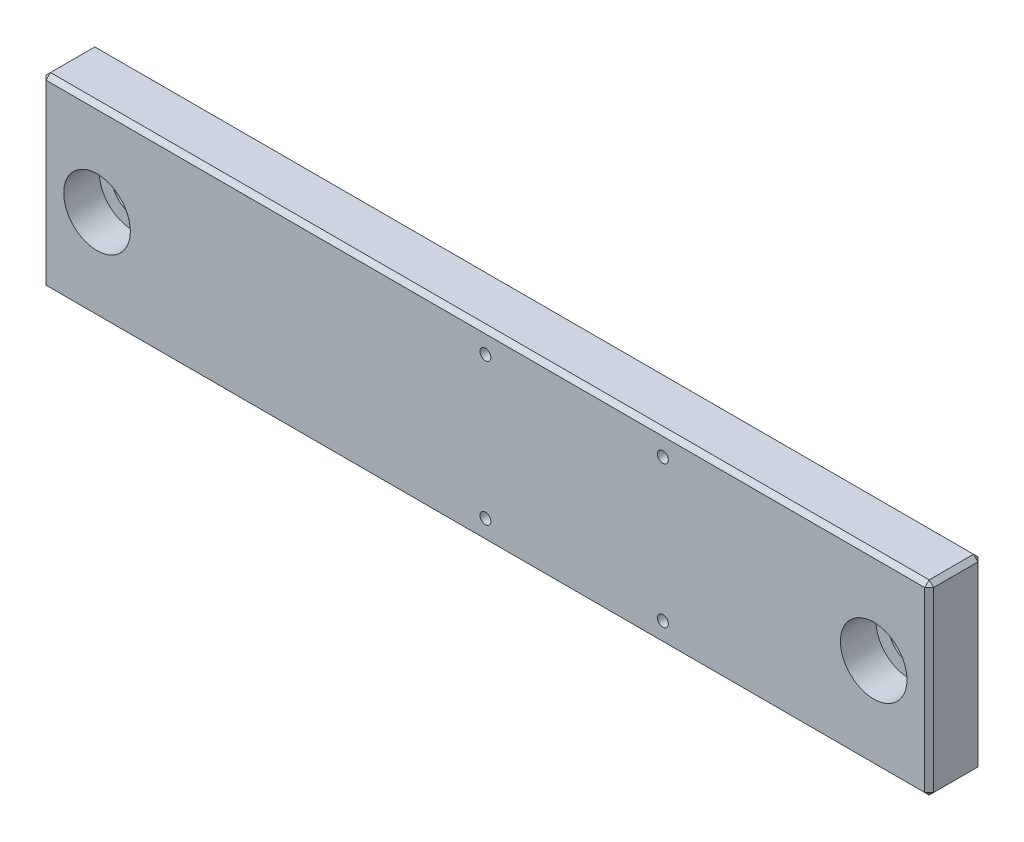
ISO-10303-21;
HEADER;
FILE_DESCRIPTION(('STEP AP214'),'2;1');
FILE_NAME('part.step','',(''),(''),'','','');
FILE_SCHEMA(('AUTOMOTIVE_DESIGN { 1 0 10303 214 1 1 1 1 }'));
ENDSEC;
DATA;
#1=APPLICATION_CONTEXT('core data for automotive mechanical design processes');
#2=APPLICATION_PROTOCOL_DEFINITION('international standard','automotive_design',2000,#1);
#3=PRODUCT_CONTEXT('',#1,'mechanical');
#4=PRODUCT('Part','Part','',(#3));
#5=PRODUCT_RELATED_PRODUCT_CATEGORY('part','',(#4));
#6=PRODUCT_DEFINITION_FORMATION('','',#4);
#7=PRODUCT_DEFINITION_CONTEXT('part definition',#1,'design');
#8=PRODUCT_DEFINITION('design','',#6,#7);
#9=PRODUCT_DEFINITION_SHAPE('','',#8);
#10=(LENGTH_UNIT() NAMED_UNIT(*) SI_UNIT(.MILLI.,.METRE.));
#11=(NAMED_UNIT(*) PLANE_ANGLE_UNIT() SI_UNIT($,.RADIAN.));
#12=(NAMED_UNIT(*) SI_UNIT($,.STERADIAN.) SOLID_ANGLE_UNIT());
#13=UNCERTAINTY_MEASURE_WITH_UNIT(LENGTH_MEASURE(1.E-05),#10,'distance_accuracy_value','');
#14=(GEOMETRIC_REPRESENTATION_CONTEXT(3) GLOBAL_UNCERTAINTY_ASSIGNED_CONTEXT((#13)) GLOBAL_UNIT_ASSIGNED_CONTEXT((#10,
#11,#12)) REPRESENTATION_CONTEXT('',''));
#15=CARTESIAN_POINT('',(0.,0.,0.));
#16=DIRECTION('',(0.,0.,1.));
#17=DIRECTION('',(1.,0.,0.));
#18=AXIS2_PLACEMENT_3D('',#15,#16,#17);
#19=CARTESIAN_POINT('',(187.5,21.,4.));
#20=DIRECTION('',(0.,0.,-1.));
#21=DIRECTION('',(-1.,0.,0.));
#22=AXIS2_PLACEMENT_3D('',#19,#20,#21);
#23=PLANE('',#22);
#24=CARTESIAN_POINT('',(187.5,21.,4.));
#25=DIRECTION('',(0.,0.,1.));
#26=DIRECTION('',(1.,0.,0.));
#27=AXIS2_PLACEMENT_3D('',#24,#25,#26);
#28=CIRCLE('',#27,7.5);
#29=CARTESIAN_POINT('',(195.,21.,4.));
#30=VERTEX_POINT('',#29);
#31=EDGE_CURVE('E11',#30,#30,#28,.T.);
#32=ORIENTED_EDGE('',*,*,#31,.T.);
#33=EDGE_LOOP('',(#32));
#34=FACE_BOUND('',#33,.T.);
#35=CARTESIAN_POINT('',(187.5,21.,3.99999999999999));
#36=DIRECTION('',(0.,0.,1.));
#37=DIRECTION('',(1.,0.,0.));
#38=AXIS2_PLACEMENT_3D('',#35,#36,#37);
#39=CIRCLE('',#38,4.5);
#40=CARTESIAN_POINT('',(192.,21.,3.99999999999999));
#41=VERTEX_POINT('',#40);
#42=EDGE_CURVE('E25',#41,#41,#39,.T.);
#43=ORIENTED_EDGE('',*,*,#42,.F.);
#44=EDGE_LOOP('',(#43));
#45=FACE_BOUND('',#44,.T.);
#46=ADVANCED_FACE('F16',(#34,#45),#23,.F.);
#47=CARTESIAN_POINT('',(187.5,21.,8.));
#48=DIRECTION('',(0.,0.,1.));
#49=DIRECTION('',(1.,0.,0.));
#50=AXIS2_PLACEMENT_3D('',#47,#48,#49);
#51=CYLINDRICAL_SURFACE('',#50,7.5);
#52=CARTESIAN_POINT('',(187.5,21.,12.));
#53=DIRECTION('',(0.,0.,-1.));
#54=DIRECTION('',(0.,-1.,0.));
#55=AXIS2_PLACEMENT_3D('',#52,#53,#54);
#56=CIRCLE('',#55,7.5);
#57=CARTESIAN_POINT('',(187.5,13.5,12.));
#58=VERTEX_POINT('',#57);
#59=EDGE_CURVE('E331',#58,#58,#56,.T.);
#60=ORIENTED_EDGE('',*,*,#59,.F.);
#61=EDGE_LOOP('',(#60));
#62=FACE_BOUND('',#61,.T.);
#63=ORIENTED_EDGE('',*,*,#31,.F.);
#64=EDGE_LOOP('',(#63));
#65=FACE_BOUND('',#64,.T.);
#66=ADVANCED_FACE('F313',(#62,#65),#51,.F.);
#67=CARTESIAN_POINT('',(187.5,21.,-192.714435250668));
#68=DIRECTION('',(0.,0.,1.));
#69=DIRECTION('',(1.,0.,0.));
#70=AXIS2_PLACEMENT_3D('',#67,#68,#69);
#71=CYLINDRICAL_SURFACE('',#70,4.5);
#72=CARTESIAN_POINT('',(187.5,21.,0.));
#73=DIRECTION('',(0.,0.,1.));
#74=DIRECTION('',(1.,0.,0.));
#75=AXIS2_PLACEMENT_3D('',#72,#73,#74);
#76=CIRCLE('',#75,4.5);
#77=CARTESIAN_POINT('',(192.,21.,0.));
#78=VERTEX_POINT('',#77);
#79=EDGE_CURVE('E174',#78,#78,#76,.T.);
#80=ORIENTED_EDGE('',*,*,#79,.F.);
#81=EDGE_LOOP('',(#80));
#82=FACE_BOUND('',#81,.T.);
#83=ORIENTED_EDGE('',*,*,#42,.T.);
#84=EDGE_LOOP('',(#83));
#85=FACE_BOUND('',#84,.T.);
#86=ADVANCED_FACE('F318',(#82,#85),#71,.F.);
#87=CARTESIAN_POINT('',(12.5,21.,4.));
#88=DIRECTION('',(0.,0.,-1.));
#89=DIRECTION('',(-1.,0.,0.));
#90=AXIS2_PLACEMENT_3D('',#87,#88,#89);
#91=PLANE('',#90);
#92=CARTESIAN_POINT('',(12.5,21.,4.));
#93=DIRECTION('',(0.,0.,1.));
#94=DIRECTION('',(1.,0.,0.));
#95=AXIS2_PLACEMENT_3D('',#92,#93,#94);
#96=CIRCLE('',#95,7.5);
#97=CARTESIAN_POINT('',(20.,21.,4.));
#98=VERTEX_POINT('',#97);
#99=EDGE_CURVE('E326',#98,#98,#96,.T.);
#100=ORIENTED_EDGE('',*,*,#99,.T.);
#101=EDGE_LOOP('',(#100));
#102=FACE_BOUND('',#101,.T.);
#103=CARTESIAN_POINT('',(12.5,21.,3.99999999999999));
#104=DIRECTION('',(0.,0.,1.));
#105=DIRECTION('',(1.,0.,0.));
#106=AXIS2_PLACEMENT_3D('',#103,#104,#105);
#107=CIRCLE('',#106,4.5);
#108=CARTESIAN_POINT('',(17.,21.,3.99999999999999));
#109=VERTEX_POINT('',#108);
#110=EDGE_CURVE('E186',#109,#109,#107,.T.);
#111=ORIENTED_EDGE('',*,*,#110,.F.);
#112=EDGE_LOOP('',(#111));
#113=FACE_BOUND('',#112,.T.);
#114=ADVANCED_FACE('F481',(#102,#113),#91,.F.);
#115=CARTESIAN_POINT('',(12.5,21.,8.));
#116=DIRECTION('',(0.,0.,1.));
#117=DIRECTION('',(1.,0.,0.));
#118=AXIS2_PLACEMENT_3D('',#115,#116,#117);
#119=CYLINDRICAL_SURFACE('',#118,7.5);
#120=CARTESIAN_POINT('',(12.5,21.,12.));
#121=DIRECTION('',(0.,0.,-1.));
#122=DIRECTION('',(0.,-1.,0.));
#123=AXIS2_PLACEMENT_3D('',#120,#121,#122);
#124=CIRCLE('',#123,7.5);
#125=CARTESIAN_POINT('',(12.5,13.5,12.));
#126=VERTEX_POINT('',#125);
#127=EDGE_CURVE('E335',#126,#126,#124,.T.);
#128=ORIENTED_EDGE('',*,*,#127,.F.);
#129=EDGE_LOOP('',(#128));
#130=FACE_BOUND('',#129,.T.);
#131=ORIENTED_EDGE('',*,*,#99,.F.);
#132=EDGE_LOOP('',(#131));
#133=FACE_BOUND('',#132,.T.);
#134=ADVANCED_FACE('F483',(#130,#133),#119,.F.);
#135=CARTESIAN_POINT('',(12.5,21.,-192.714435250668));
#136=DIRECTION('',(0.,0.,1.));
#137=DIRECTION('',(1.,0.,0.));
#138=AXIS2_PLACEMENT_3D('',#135,#136,#137);
#139=CYLINDRICAL_SURFACE('',#138,4.5);
#140=CARTESIAN_POINT('',(12.5,21.,0.));
#141=DIRECTION('',(0.,0.,1.));
#142=DIRECTION('',(1.,0.,0.));
#143=AXIS2_PLACEMENT_3D('',#140,#141,#142);
#144=CIRCLE('',#143,4.5);
#145=CARTESIAN_POINT('',(17.,21.,0.));
#146=VERTEX_POINT('',#145);
#147=EDGE_CURVE('E337',#146,#146,#144,.T.);
#148=ORIENTED_EDGE('',*,*,#147,.F.);
#149=EDGE_LOOP('',(#148));
#150=FACE_BOUND('',#149,.T.);
#151=ORIENTED_EDGE('',*,*,#110,.T.);
#152=EDGE_LOOP('',(#151));
#153=FACE_BOUND('',#152,.T.);
#154=ADVANCED_FACE('F489',(#150,#153),#139,.F.);
#155=CARTESIAN_POINT('',(100.,37.,-192.714435250668));
#156=DIRECTION('',(0.,0.,1.));
#157=DIRECTION('',(1.,0.,0.));
#158=AXIS2_PLACEMENT_3D('',#155,#156,#157);
#159=CYLINDRICAL_SURFACE('',#158,1.2295);
#160=CARTESIAN_POINT('',(100.,37.,0.));
#161=DIRECTION('',(0.,0.,1.));
#162=DIRECTION('',(1.,0.,0.));
#163=AXIS2_PLACEMENT_3D('',#160,#161,#162);
#164=CIRCLE('',#163,1.2295);
#165=CARTESIAN_POINT('',(101.2295,37.,0.));
#166=VERTEX_POINT('',#165);
#167=EDGE_CURVE('E346',#166,#166,#164,.T.);
#168=ORIENTED_EDGE('',*,*,#167,.F.);
#169=EDGE_LOOP('',(#168));
#170=FACE_BOUND('',#169,.T.);
#171=CARTESIAN_POINT('',(100.,37.,12.));
#172=DIRECTION('',(0.,0.,-1.));
#173=DIRECTION('',(0.,-1.,0.));
#174=AXIS2_PLACEMENT_3D('',#171,#172,#173);
#175=CIRCLE('',#174,1.2295);
#176=CARTESIAN_POINT('',(100.,35.7705,12.));
#177=VERTEX_POINT('',#176);
#178=EDGE_CURVE('E343',#177,#177,#175,.T.);
#179=ORIENTED_EDGE('',*,*,#178,.F.);
#180=EDGE_LOOP('',(#179));
#181=FACE_BOUND('',#180,.T.);
#182=ADVANCED_FACE('F499',(#170,#181),#159,.F.);
#183=CARTESIAN_POINT('',(100.,5.,-192.714435250668));
#184=DIRECTION('',(0.,0.,1.));
#185=DIRECTION('',(1.,0.,0.));
#186=AXIS2_PLACEMENT_3D('',#183,#184,#185);
#187=CYLINDRICAL_SURFACE('',#186,1.2295);
#188=CARTESIAN_POINT('',(100.,5.,0.));
#189=DIRECTION('',(0.,0.,1.));
#190=DIRECTION('',(1.,0.,0.));
#191=AXIS2_PLACEMENT_3D('',#188,#189,#190);
#192=CIRCLE('',#191,1.2295);
#193=CARTESIAN_POINT('',(101.2295,5.,0.));
#194=VERTEX_POINT('',#193);
#195=EDGE_CURVE('E349',#194,#194,#192,.T.);
#196=ORIENTED_EDGE('',*,*,#195,.F.);
#197=EDGE_LOOP('',(#196));
#198=FACE_BOUND('',#197,.T.);
#199=CARTESIAN_POINT('',(100.,5.,12.));
#200=DIRECTION('',(0.,0.,-1.));
#201=DIRECTION('',(0.,-1.,0.));
#202=AXIS2_PLACEMENT_3D('',#199,#200,#201);
#203=CIRCLE('',#202,1.2295);
#204=CARTESIAN_POINT('',(100.,3.7705,12.));
#205=VERTEX_POINT('',#204);
#206=EDGE_CURVE('E352',#205,#205,#203,.T.);
#207=ORIENTED_EDGE('',*,*,#206,.F.);
#208=EDGE_LOOP('',(#207));
#209=FACE_BOUND('',#208,.T.);
#210=ADVANCED_FACE('F505',(#198,#209),#187,.F.);
#211=CARTESIAN_POINT('',(140.,5.,-192.714435250668));
#212=DIRECTION('',(0.,0.,1.));
#213=DIRECTION('',(1.,0.,0.));
#214=AXIS2_PLACEMENT_3D('',#211,#212,#213);
#215=CYLINDRICAL_SURFACE('',#214,1.2295);
#216=CARTESIAN_POINT('',(140.,5.,0.));
#217=DIRECTION('',(0.,0.,1.));
#218=DIRECTION('',(1.,0.,0.));
#219=AXIS2_PLACEMENT_3D('',#216,#217,#218);
#220=CIRCLE('',#219,1.2295);
#221=CARTESIAN_POINT('',(141.2295,5.,0.));
#222=VERTEX_POINT('',#221);
#223=EDGE_CURVE('E355',#222,#222,#220,.T.);
#224=ORIENTED_EDGE('',*,*,#223,.F.);
#225=EDGE_LOOP('',(#224));
#226=FACE_BOUND('',#225,.T.);
#227=CARTESIAN_POINT('',(140.,5.,12.));
#228=DIRECTION('',(0.,0.,-1.));
#229=DIRECTION('',(0.,-1.,0.));
#230=AXIS2_PLACEMENT_3D('',#227,#228,#229);
#231=CIRCLE('',#230,1.2295);
#232=CARTESIAN_POINT('',(140.,3.7705,12.));
#233=VERTEX_POINT('',#232);
#234=EDGE_CURVE('E358',#233,#233,#231,.T.);
#235=ORIENTED_EDGE('',*,*,#234,.F.);
#236=EDGE_LOOP('',(#235));
#237=FACE_BOUND('',#236,.T.);
#238=ADVANCED_FACE('F512',(#226,#237),#215,.F.);
#239=CARTESIAN_POINT('',(140.,37.,-192.714435250668));
#240=DIRECTION('',(0.,0.,1.));
#241=DIRECTION('',(1.,0.,0.));
#242=AXIS2_PLACEMENT_3D('',#239,#240,#241);
#243=CYLINDRICAL_SURFACE('',#242,1.2295);
#244=CARTESIAN_POINT('',(140.,37.,0.));
#245=DIRECTION('',(0.,0.,1.));
#246=DIRECTION('',(1.,0.,0.));
#247=AXIS2_PLACEMENT_3D('',#244,#245,#246);
#248=CIRCLE('',#247,1.2295);
#249=CARTESIAN_POINT('',(141.2295,37.,0.));
#250=VERTEX_POINT('',#249);
#251=EDGE_CURVE('E334',#250,#250,#248,.T.);
#252=ORIENTED_EDGE('',*,*,#251,.F.);
#253=EDGE_LOOP('',(#252));
#254=FACE_BOUND('',#253,.T.);
#255=CARTESIAN_POINT('',(140.,37.,12.));
#256=DIRECTION('',(0.,0.,-1.));
#257=DIRECTION('',(0.,-1.,0.));
#258=AXIS2_PLACEMENT_3D('',#255,#256,#257);
#259=CIRCLE('',#258,1.2295);
#260=CARTESIAN_POINT('',(140.,35.7705,12.));
#261=VERTEX_POINT('',#260);
#262=EDGE_CURVE('E363',#261,#261,#259,.T.);
#263=ORIENTED_EDGE('',*,*,#262,.F.);
#264=EDGE_LOOP('',(#263));
#265=FACE_BOUND('',#264,.T.);
#266=ADVANCED_FACE('F516',(#254,#265),#243,.F.);
#267=CARTESIAN_POINT('',(199.,41.,0.));
#268=DIRECTION('',(0.57735026918962,0.57735026918963,-0.577350269189628));
#269=DIRECTION('',(0.,0.707106781186546,0.707106781186549));
#270=AXIS2_PLACEMENT_3D('',#267,#268,#269);
#271=PLANE('',#270);
#272=DIRECTION('',(-0.707106781186554,0.707106781186541,0.));
#273=VECTOR('',#272,1.);
#274=CARTESIAN_POINT('',(200.,41.,1.));
#275=LINE('',#274,#273);
#276=CARTESIAN_POINT('',(200.,41.,1.));
#277=VERTEX_POINT('',#276);
#278=CARTESIAN_POINT('',(199.,42.,1.));
#279=VERTEX_POINT('',#278);
#280=EDGE_CURVE('E207',#277,#279,#275,.T.);
#281=ORIENTED_EDGE('',*,*,#280,.F.);
#282=DIRECTION('',(0.707106781186553,0.,0.707106781186543));
#283=VECTOR('',#282,1.);
#284=CARTESIAN_POINT('',(199.,41.,0.));
#285=LINE('',#284,#283);
#286=CARTESIAN_POINT('',(199.,41.,0.));
#287=VERTEX_POINT('',#286);
#288=EDGE_CURVE('E34',#287,#277,#285,.T.);
#289=ORIENTED_EDGE('',*,*,#288,.F.);
#290=DIRECTION('',(0.,-0.707106781186546,-0.707106781186549));
#291=VECTOR('',#290,1.);
#292=CARTESIAN_POINT('',(199.,42.,1.));
#293=LINE('',#292,#291);
#294=EDGE_CURVE('E191',#279,#287,#293,.T.);
#295=ORIENTED_EDGE('',*,*,#294,.F.);
#296=EDGE_LOOP('',(#281,#289,#295));
#297=FACE_BOUND('',#296,.T.);
#298=ADVANCED_FACE('F371',(#297),#271,.T.);
#299=CARTESIAN_POINT('',(199.,1.,0.));
#300=DIRECTION('',(0.577350269189619,-0.577350269189629,-0.57735026918963));
#301=DIRECTION('',(0.,0.707106781186548,-0.707106781186547));
#302=AXIS2_PLACEMENT_3D('',#299,#300,#301);
#303=PLANE('',#302);
#304=DIRECTION('',(0.707106781186554,0.707106781186541,0.));
#305=VECTOR('',#304,1.);
#306=CARTESIAN_POINT('',(199.,0.,1.));
#307=LINE('',#306,#305);
#308=CARTESIAN_POINT('',(199.,0.,1.));
#309=VERTEX_POINT('',#308);
#310=CARTESIAN_POINT('',(200.,0.999999999999997,1.));
#311=VERTEX_POINT('',#310);
#312=EDGE_CURVE('E227',#309,#311,#307,.T.);
#313=ORIENTED_EDGE('',*,*,#312,.F.);
#314=DIRECTION('',(0.,-0.707106781186548,0.707106781186547));
#315=VECTOR('',#314,1.);
#316=CARTESIAN_POINT('',(199.,1.,0.));
#317=LINE('',#316,#315);
#318=CARTESIAN_POINT('',(199.,1.,0.));
#319=VERTEX_POINT('',#318);
#320=EDGE_CURVE('E177',#319,#309,#317,.T.);
#321=ORIENTED_EDGE('',*,*,#320,.F.);
#322=DIRECTION('',(-0.707106781186553,0.,-0.707106781186543));
#323=VECTOR('',#322,1.);
#324=CARTESIAN_POINT('',(200.,0.999999999999997,1.));
#325=LINE('',#324,#323);
#326=EDGE_CURVE('E169',#311,#319,#325,.T.);
#327=ORIENTED_EDGE('',*,*,#326,.F.);
#328=EDGE_LOOP('',(#313,#321,#327));
#329=FACE_BOUND('',#328,.T.);
#330=ADVANCED_FACE('F523',(#329),#303,.T.);
#331=CARTESIAN_POINT('',(0.999999999999997,41.,0.));
#332=DIRECTION('',(-0.577350269189626,0.577350269189627,-0.577350269189625));
#333=DIRECTION('',(-0.707106781186548,-0.707106781186547,0.));
#334=AXIS2_PLACEMENT_3D('',#331,#332,#333);
#335=PLANE('',#334);
#336=DIRECTION('',(-0.707106781186549,-0.707106781186546,0.));
#337=VECTOR('',#336,1.);
#338=CARTESIAN_POINT('',(0.999999999999997,42.,1.));
#339=LINE('',#338,#337);
#340=CARTESIAN_POINT('',(0.999999999999997,42.,1.));
#341=VERTEX_POINT('',#340);
#342=CARTESIAN_POINT('',(0.,41.,1.));
#343=VERTEX_POINT('',#342);
#344=EDGE_CURVE('E179',#341,#343,#339,.T.);
#345=ORIENTED_EDGE('',*,*,#344,.F.);
#346=DIRECTION('',(0.,0.707106781186546,0.707106781186549));
#347=VECTOR('',#346,1.);
#348=CARTESIAN_POINT('',(0.999999999999997,41.,0.));
#349=LINE('',#348,#347);
#350=CARTESIAN_POINT('',(0.999999999999994,41.,0.));
#351=VERTEX_POINT('',#350);
#352=EDGE_CURVE('E183',#351,#341,#349,.T.);
#353=ORIENTED_EDGE('',*,*,#352,.F.);
#354=DIRECTION('',(0.707106781186547,0.,-0.707106781186549));
#355=VECTOR('',#354,1.);
#356=CARTESIAN_POINT('',(0.,41.,1.));
#357=LINE('',#356,#355);
#358=EDGE_CURVE('E165',#343,#351,#357,.T.);
#359=ORIENTED_EDGE('',*,*,#358,.F.);
#360=EDGE_LOOP('',(#345,#353,#359));
#361=FACE_BOUND('',#360,.T.);
#362=ADVANCED_FACE('F299',(#361),#335,.T.);
#363=CARTESIAN_POINT('',(50.,41.5,0.5));
#364=DIRECTION('',(0.,0.707106781186549,-0.707106781186546));
#365=DIRECTION('',(0.,0.707106781186546,0.707106781186549));
#366=AXIS2_PLACEMENT_3D('',#363,#364,#365);
#367=PLANE('',#366);
#368=ORIENTED_EDGE('',*,*,#352,.T.);
#369=DIRECTION('',(1.,0.,0.));
#370=VECTOR('',#369,1.);
#371=CARTESIAN_POINT('',(50.,42.,1.));
#372=LINE('',#371,#370);
#373=EDGE_CURVE('E187',#341,#279,#372,.T.);
#374=ORIENTED_EDGE('',*,*,#373,.T.);
#375=ORIENTED_EDGE('',*,*,#294,.T.);
#376=DIRECTION('',(-1.,0.,0.));
#377=VECTOR('',#376,1.);
#378=CARTESIAN_POINT('',(50.,41.,0.));
#379=LINE('',#378,#377);
#380=EDGE_CURVE('E192',#287,#351,#379,.T.);
#381=ORIENTED_EDGE('',*,*,#380,.T.);
#382=EDGE_LOOP('',(#368,#374,#375,#381));
#383=FACE_BOUND('',#382,.T.);
#384=ADVANCED_FACE('F296',(#383),#367,.T.);
#385=CARTESIAN_POINT('',(199.,42.,11.));
#386=DIRECTION('',(0.57735026918962,0.57735026918963,0.577350269189628));
#387=DIRECTION('',(0.,-0.707106781186546,0.707106781186549));
#388=AXIS2_PLACEMENT_3D('',#385,#386,#387);
#389=PLANE('',#388);
#390=DIRECTION('',(-0.707106781186552,0.,0.707106781186543));
#391=VECTOR('',#390,1.);
#392=CARTESIAN_POINT('',(200.,41.,11.));
#393=LINE('',#392,#391);
#394=CARTESIAN_POINT('',(200.,41.,11.));
#395=VERTEX_POINT('',#394);
#396=CARTESIAN_POINT('',(199.,41.,12.));
#397=VERTEX_POINT('',#396);
#398=EDGE_CURVE('E196',#395,#397,#393,.T.);
#399=ORIENTED_EDGE('',*,*,#398,.F.);
#400=DIRECTION('',(0.707106781186554,-0.707106781186541,0.));
#401=VECTOR('',#400,1.);
#402=CARTESIAN_POINT('',(199.,42.,11.));
#403=LINE('',#402,#401);
#404=CARTESIAN_POINT('',(199.,42.,11.));
#405=VERTEX_POINT('',#404);
#406=EDGE_CURVE('E195',#405,#395,#403,.T.);
#407=ORIENTED_EDGE('',*,*,#406,.F.);
#408=DIRECTION('',(0.,0.707106781186546,-0.707106781186549));
#409=VECTOR('',#408,1.);
#410=CARTESIAN_POINT('',(199.,41.,12.));
#411=LINE('',#410,#409);
#412=EDGE_CURVE('E153',#397,#405,#411,.T.);
#413=ORIENTED_EDGE('',*,*,#412,.F.);
#414=EDGE_LOOP('',(#399,#407,#413));
#415=FACE_BOUND('',#414,.T.);
#416=ADVANCED_FACE('F376',(#415),#389,.T.);
#417=CARTESIAN_POINT('',(199.5,41.5,0.));
#418=DIRECTION('',(0.707106781186541,0.707106781186554,0.));
#419=DIRECTION('',(-0.707106781186554,0.707106781186541,0.));
#420=AXIS2_PLACEMENT_3D('',#417,#418,#419);
#421=PLANE('',#420);
#422=ORIENTED_EDGE('',*,*,#406,.T.);
#423=DIRECTION('',(0.,0.,-1.));
#424=VECTOR('',#423,1.);
#425=CARTESIAN_POINT('',(200.,41.,0.));
#426=LINE('',#425,#424);
#427=EDGE_CURVE('E203',#395,#277,#426,.T.);
#428=ORIENTED_EDGE('',*,*,#427,.T.);
#429=ORIENTED_EDGE('',*,*,#280,.T.);
#430=DIRECTION('',(0.,0.,1.));
#431=VECTOR('',#430,1.);
#432=CARTESIAN_POINT('',(199.,42.,0.));
#433=LINE('',#432,#431);
#434=EDGE_CURVE('E208',#279,#405,#433,.T.);
#435=ORIENTED_EDGE('',*,*,#434,.T.);
#436=EDGE_LOOP('',(#422,#428,#429,#435));
#437=FACE_BOUND('',#436,.T.);
#438=ADVANCED_FACE('F373',(#437),#421,.T.);
#439=CARTESIAN_POINT('',(1.00000000000001,0.,1.));
#440=DIRECTION('',(-0.577350269189624,-0.577350269189632,-0.577350269189622));
#441=DIRECTION('',(0.707106781186552,-0.707106781186542,0.));
#442=AXIS2_PLACEMENT_3D('',#439,#440,#441);
#443=PLANE('',#442);
#444=DIRECTION('',(-0.707106781186547,0.,0.707106781186549));
#445=VECTOR('',#444,1.);
#446=CARTESIAN_POINT('',(0.999999999999997,1.,0.));
#447=LINE('',#446,#445);
#448=CARTESIAN_POINT('',(0.999999999999997,1.,0.));
#449=VERTEX_POINT('',#448);
#450=CARTESIAN_POINT('',(0.,1.,1.));
#451=VERTEX_POINT('',#450);
#452=EDGE_CURVE('E161',#449,#451,#447,.T.);
#453=ORIENTED_EDGE('',*,*,#452,.F.);
#454=DIRECTION('',(0.,0.707106781186548,-0.707106781186547));
#455=VECTOR('',#454,1.);
#456=CARTESIAN_POINT('',(1.00000000000001,0.,1.));
#457=LINE('',#456,#455);
#458=CARTESIAN_POINT('',(1.00000000000001,0.,1.));
#459=VERTEX_POINT('',#458);
#460=EDGE_CURVE('E212',#459,#449,#457,.T.);
#461=ORIENTED_EDGE('',*,*,#460,.F.);
#462=DIRECTION('',(0.707106781186553,-0.707106781186542,0.));
#463=VECTOR('',#462,1.);
#464=CARTESIAN_POINT('',(0.,1.,1.));
#465=LINE('',#464,#463);
#466=EDGE_CURVE('E127',#451,#459,#465,.T.);
#467=ORIENTED_EDGE('',*,*,#466,.F.);
#468=EDGE_LOOP('',(#453,#461,#467));
#469=FACE_BOUND('',#468,.T.);
#470=ADVANCED_FACE('F253',(#469),#443,.T.);
#471=CARTESIAN_POINT('',(150.,0.5,0.5));
#472=DIRECTION('',(0.,-0.707106781186547,-0.707106781186548));
#473=DIRECTION('',(0.,0.707106781186548,-0.707106781186547));
#474=AXIS2_PLACEMENT_3D('',#471,#472,#473);
#475=PLANE('',#474);
#476=ORIENTED_EDGE('',*,*,#320,.T.);
#477=DIRECTION('',(-1.,0.,0.));
#478=VECTOR('',#477,1.);
#479=CARTESIAN_POINT('',(150.,0.,1.));
#480=LINE('',#479,#478);
#481=EDGE_CURVE('E215',#309,#459,#480,.T.);
#482=ORIENTED_EDGE('',*,*,#481,.T.);
#483=ORIENTED_EDGE('',*,*,#460,.T.);
#484=DIRECTION('',(1.,0.,0.));
#485=VECTOR('',#484,1.);
#486=CARTESIAN_POINT('',(150.,1.,0.));
#487=LINE('',#486,#485);
#488=EDGE_CURVE('E216',#449,#319,#487,.T.);
#489=ORIENTED_EDGE('',*,*,#488,.T.);
#490=EDGE_LOOP('',(#476,#482,#483,#489));
#491=FACE_BOUND('',#490,.T.);
#492=ADVANCED_FACE('F256',(#491),#475,.T.);
#493=CARTESIAN_POINT('',(200.,0.999999999999997,11.));
#494=DIRECTION('',(0.577350269189619,-0.577350269189629,0.577350269189629));
#495=DIRECTION('',(0.,-0.707106781186548,-0.707106781186548));
#496=AXIS2_PLACEMENT_3D('',#493,#494,#495);
#497=PLANE('',#496);
#498=DIRECTION('',(0.,0.707106781186548,0.707106781186548));
#499=VECTOR('',#498,1.);
#500=CARTESIAN_POINT('',(199.,0.,11.));
#501=LINE('',#500,#499);
#502=CARTESIAN_POINT('',(199.,0.,11.));
#503=VERTEX_POINT('',#502);
#504=CARTESIAN_POINT('',(199.,1.,12.));
#505=VERTEX_POINT('',#504);
#506=EDGE_CURVE('E142',#503,#505,#501,.T.);
#507=ORIENTED_EDGE('',*,*,#506,.F.);
#508=DIRECTION('',(-0.707106781186554,-0.707106781186541,0.));
#509=VECTOR('',#508,1.);
#510=CARTESIAN_POINT('',(200.,0.999999999999997,11.));
#511=LINE('',#510,#509);
#512=CARTESIAN_POINT('',(200.,0.999999999999997,11.));
#513=VERTEX_POINT('',#512);
#514=EDGE_CURVE('E220',#513,#503,#511,.T.);
#515=ORIENTED_EDGE('',*,*,#514,.F.);
#516=DIRECTION('',(0.707106781186552,0.,-0.707106781186543));
#517=VECTOR('',#516,1.);
#518=CARTESIAN_POINT('',(199.,1.,12.));
#519=LINE('',#518,#517);
#520=EDGE_CURVE('E223',#505,#513,#519,.T.);
#521=ORIENTED_EDGE('',*,*,#520,.F.);
#522=EDGE_LOOP('',(#507,#515,#521));
#523=FACE_BOUND('',#522,.T.);
#524=ADVANCED_FACE('F268',(#523),#497,.T.);
#525=CARTESIAN_POINT('',(199.5,0.499999999999998,0.));
#526=DIRECTION('',(0.707106781186541,-0.707106781186554,0.));
#527=DIRECTION('',(0.707106781186554,0.707106781186541,0.));
#528=AXIS2_PLACEMENT_3D('',#525,#526,#527);
#529=PLANE('',#528);
#530=ORIENTED_EDGE('',*,*,#514,.T.);
#531=DIRECTION('',(0.,0.,-1.));
#532=VECTOR('',#531,1.);
#533=CARTESIAN_POINT('',(199.,0.,0.));
#534=LINE('',#533,#532);
#535=EDGE_CURVE('E140',#503,#309,#534,.T.);
#536=ORIENTED_EDGE('',*,*,#535,.T.);
#537=ORIENTED_EDGE('',*,*,#312,.T.);
#538=DIRECTION('',(0.,0.,1.));
#539=VECTOR('',#538,1.);
#540=CARTESIAN_POINT('',(200.,0.999999999999997,0.));
#541=LINE('',#540,#539);
#542=EDGE_CURVE('E225',#311,#513,#541,.T.);
#543=ORIENTED_EDGE('',*,*,#542,.T.);
#544=EDGE_LOOP('',(#530,#536,#537,#543));
#545=FACE_BOUND('',#544,.T.);
#546=ADVANCED_FACE('F262',(#545),#529,.T.);
#547=CARTESIAN_POINT('',(199.5,31.5,11.5));
#548=DIRECTION('',(0.707106781186543,0.,0.707106781186552));
#549=DIRECTION('',(0.707106781186552,0.,-0.707106781186543));
#550=AXIS2_PLACEMENT_3D('',#547,#548,#549);
#551=PLANE('',#550);
#552=ORIENTED_EDGE('',*,*,#520,.T.);
#553=DIRECTION('',(0.,1.,0.));
#554=VECTOR('',#553,1.);
#555=CARTESIAN_POINT('',(200.,31.5,11.));
#556=LINE('',#555,#554);
#557=EDGE_CURVE('E199',#513,#395,#556,.T.);
#558=ORIENTED_EDGE('',*,*,#557,.T.);
#559=ORIENTED_EDGE('',*,*,#398,.T.);
#560=DIRECTION('',(0.,-1.,0.));
#561=VECTOR('',#560,1.);
#562=CARTESIAN_POINT('',(199.,31.5,12.));
#563=LINE('',#562,#561);
#564=EDGE_CURVE('E200',#397,#505,#563,.T.);
#565=ORIENTED_EDGE('',*,*,#564,.T.);
#566=EDGE_LOOP('',(#552,#558,#559,#565));
#567=FACE_BOUND('',#566,.T.);
#568=ADVANCED_FACE('F273',(#567),#551,.T.);
#569=CARTESIAN_POINT('',(0.,41.,11.));
#570=DIRECTION('',(-0.577350269189626,0.577350269189628,0.577350269189624));
#571=DIRECTION('',(-0.707106781186549,-0.707106781186546,0.));
#572=AXIS2_PLACEMENT_3D('',#569,#570,#571);
#573=PLANE('',#572);
#574=DIRECTION('',(0.,-0.707106781186546,0.707106781186549));
#575=VECTOR('',#574,1.);
#576=CARTESIAN_POINT('',(0.999999999999997,42.,11.));
#577=LINE('',#576,#575);
#578=CARTESIAN_POINT('',(0.999999999999997,42.,11.));
#579=VERTEX_POINT('',#578);
#580=CARTESIAN_POINT('',(0.999999999999997,41.,12.));
#581=VERTEX_POINT('',#580);
#582=EDGE_CURVE('E157',#579,#581,#577,.T.);
#583=ORIENTED_EDGE('',*,*,#582,.F.);
#584=DIRECTION('',(0.707106781186549,0.707106781186546,0.));
#585=VECTOR('',#584,1.);
#586=CARTESIAN_POINT('',(0.,41.,11.));
#587=LINE('',#586,#585);
#588=CARTESIAN_POINT('',(0.,41.,11.));
#589=VERTEX_POINT('',#588);
#590=EDGE_CURVE('E234',#589,#579,#587,.T.);
#591=ORIENTED_EDGE('',*,*,#590,.F.);
#592=DIRECTION('',(-0.707106781186546,0.,-0.707106781186549));
#593=VECTOR('',#592,1.);
#594=CARTESIAN_POINT('',(0.999999999999994,41.,12.));
#595=LINE('',#594,#593);
#596=EDGE_CURVE('E148',#581,#589,#595,.T.);
#597=ORIENTED_EDGE('',*,*,#596,.F.);
#598=EDGE_LOOP('',(#583,#591,#597));
#599=FACE_BOUND('',#598,.T.);
#600=ADVANCED_FACE('F282',(#599),#573,.T.);
#601=CARTESIAN_POINT('',(0.499999999999997,41.5,0.));
#602=DIRECTION('',(-0.707106781186546,0.707106781186549,0.));
#603=DIRECTION('',(-0.707106781186549,-0.707106781186546,0.));
#604=AXIS2_PLACEMENT_3D('',#601,#602,#603);
#605=PLANE('',#604);
#606=ORIENTED_EDGE('',*,*,#590,.T.);
#607=DIRECTION('',(0.,0.,-1.));
#608=VECTOR('',#607,1.);
#609=CARTESIAN_POINT('',(0.999999999999997,42.,0.));
#610=LINE('',#609,#608);
#611=EDGE_CURVE('E182',#579,#341,#610,.T.);
#612=ORIENTED_EDGE('',*,*,#611,.T.);
#613=ORIENTED_EDGE('',*,*,#344,.T.);
#614=DIRECTION('',(0.,0.,1.));
#615=VECTOR('',#614,1.);
#616=CARTESIAN_POINT('',(0.,41.,0.));
#617=LINE('',#616,#615);
#618=EDGE_CURVE('E134',#343,#589,#617,.T.);
#619=ORIENTED_EDGE('',*,*,#618,.T.);
#620=EDGE_LOOP('',(#606,#612,#613,#619));
#621=FACE_BOUND('',#620,.T.);
#622=ADVANCED_FACE('F285',(#621),#605,.T.);
#623=CARTESIAN_POINT('',(1.00000000000001,0.,11.));
#624=DIRECTION('',(-0.577350269189624,-0.577350269189632,0.577350269189622));
#625=DIRECTION('',(0.707106781186553,-0.707106781186542,0.));
#626=AXIS2_PLACEMENT_3D('',#623,#624,#625);
#627=PLANE('',#626);
#628=DIRECTION('',(0.707106781186546,0.,0.707106781186549));
#629=VECTOR('',#628,1.);
#630=CARTESIAN_POINT('',(0.,1.,11.));
#631=LINE('',#630,#629);
#632=CARTESIAN_POINT('',(0.,1.,11.));
#633=VERTEX_POINT('',#632);
#634=CARTESIAN_POINT('',(0.999999999999997,1.,12.));
#635=VERTEX_POINT('',#634);
#636=EDGE_CURVE('E102',#633,#635,#631,.T.);
#637=ORIENTED_EDGE('',*,*,#636,.F.);
#638=DIRECTION('',(-0.707106781186553,0.707106781186542,0.));
#639=VECTOR('',#638,1.);
#640=CARTESIAN_POINT('',(1.00000000000001,0.,11.));
#641=LINE('',#640,#639);
#642=CARTESIAN_POINT('',(1.00000000000001,0.,11.));
#643=VERTEX_POINT('',#642);
#644=EDGE_CURVE('E125',#643,#633,#641,.T.);
#645=ORIENTED_EDGE('',*,*,#644,.F.);
#646=DIRECTION('',(0.,-0.707106781186548,-0.707106781186548));
#647=VECTOR('',#646,1.);
#648=CARTESIAN_POINT('',(0.999999999999997,1.,12.));
#649=LINE('',#648,#647);
#650=EDGE_CURVE('E108',#635,#643,#649,.T.);
#651=ORIENTED_EDGE('',*,*,#650,.F.);
#652=EDGE_LOOP('',(#637,#645,#651));
#653=FACE_BOUND('',#652,.T.);
#654=ADVANCED_FACE('F132',(#653),#627,.T.);
#655=CARTESIAN_POINT('',(0.500000000000007,0.5,0.));
#656=DIRECTION('',(-0.707106781186542,-0.707106781186553,0.));
#657=DIRECTION('',(0.707106781186553,-0.707106781186542,0.));
#658=AXIS2_PLACEMENT_3D('',#655,#656,#657);
#659=PLANE('',#658);
#660=ORIENTED_EDGE('',*,*,#644,.T.);
#661=DIRECTION('',(0.,0.,-1.));
#662=VECTOR('',#661,1.);
#663=CARTESIAN_POINT('',(0.,1.,0.));
#664=LINE('',#663,#662);
#665=EDGE_CURVE('E135',#633,#451,#664,.T.);
#666=ORIENTED_EDGE('',*,*,#665,.T.);
#667=ORIENTED_EDGE('',*,*,#466,.T.);
#668=DIRECTION('',(0.,0.,1.));
#669=VECTOR('',#668,1.);
#670=CARTESIAN_POINT('',(1.00000000000001,0.,0.));
#671=LINE('',#670,#669);
#672=EDGE_CURVE('E118',#459,#643,#671,.T.);
#673=ORIENTED_EDGE('',*,*,#672,.T.);
#674=EDGE_LOOP('',(#660,#666,#667,#673));
#675=FACE_BOUND('',#674,.T.);
#676=ADVANCED_FACE('F123',(#675),#659,.T.);
#677=CARTESIAN_POINT('',(150.,0.5,11.5));
#678=DIRECTION('',(0.,-0.707106781186548,0.707106781186548));
#679=DIRECTION('',(0.,-0.707106781186548,-0.707106781186548));
#680=AXIS2_PLACEMENT_3D('',#677,#678,#679);
#681=PLANE('',#680);
#682=ORIENTED_EDGE('',*,*,#650,.T.);
#683=DIRECTION('',(1.,0.,0.));
#684=VECTOR('',#683,1.);
#685=CARTESIAN_POINT('',(150.,0.,11.));
#686=LINE('',#685,#684);
#687=EDGE_CURVE('E112',#643,#503,#686,.T.);
#688=ORIENTED_EDGE('',*,*,#687,.T.);
#689=ORIENTED_EDGE('',*,*,#506,.T.);
#690=DIRECTION('',(-1.,0.,0.));
#691=VECTOR('',#690,1.);
#692=CARTESIAN_POINT('',(150.,1.,12.));
#693=LINE('',#692,#691);
#694=EDGE_CURVE('E114',#505,#635,#693,.T.);
#695=ORIENTED_EDGE('',*,*,#694,.T.);
#696=EDGE_LOOP('',(#682,#688,#689,#695));
#697=FACE_BOUND('',#696,.T.);
#698=ADVANCED_FACE('F110',(#697),#681,.T.);
#699=CARTESIAN_POINT('',(0.499999999999998,10.5,11.5));
#700=DIRECTION('',(-0.707106781186549,0.,0.707106781186546));
#701=DIRECTION('',(0.707106781186546,0.,0.707106781186549));
#702=AXIS2_PLACEMENT_3D('',#699,#700,#701);
#703=PLANE('',#702);
#704=ORIENTED_EDGE('',*,*,#596,.T.);
#705=DIRECTION('',(0.,-1.,0.));
#706=VECTOR('',#705,1.);
#707=CARTESIAN_POINT('',(0.,10.5,11.));
#708=LINE('',#707,#706);
#709=EDGE_CURVE('E149',#589,#633,#708,.T.);
#710=ORIENTED_EDGE('',*,*,#709,.T.);
#711=ORIENTED_EDGE('',*,*,#636,.T.);
#712=DIRECTION('',(0.,1.,0.));
#713=VECTOR('',#712,1.);
#714=CARTESIAN_POINT('',(0.999999999999997,10.5,12.));
#715=LINE('',#714,#713);
#716=EDGE_CURVE('E151',#635,#581,#715,.T.);
#717=ORIENTED_EDGE('',*,*,#716,.T.);
#718=EDGE_LOOP('',(#704,#710,#711,#717));
#719=FACE_BOUND('',#718,.T.);
#720=ADVANCED_FACE('F279',(#719),#703,.T.);
#721=CARTESIAN_POINT('',(50.,41.5,11.5));
#722=DIRECTION('',(0.,0.707106781186549,0.707106781186546));
#723=DIRECTION('',(0.,-0.707106781186546,0.707106781186549));
#724=AXIS2_PLACEMENT_3D('',#721,#722,#723);
#725=PLANE('',#724);
#726=ORIENTED_EDGE('',*,*,#412,.T.);
#727=DIRECTION('',(-1.,0.,0.));
#728=VECTOR('',#727,1.);
#729=CARTESIAN_POINT('',(50.,42.,11.));
#730=LINE('',#729,#728);
#731=EDGE_CURVE('E154',#405,#579,#730,.T.);
#732=ORIENTED_EDGE('',*,*,#731,.T.);
#733=ORIENTED_EDGE('',*,*,#582,.T.);
#734=DIRECTION('',(1.,0.,0.));
#735=VECTOR('',#734,1.);
#736=CARTESIAN_POINT('',(50.,41.,12.));
#737=LINE('',#736,#735);
#738=EDGE_CURVE('E158',#581,#397,#737,.T.);
#739=ORIENTED_EDGE('',*,*,#738,.T.);
#740=EDGE_LOOP('',(#726,#732,#733,#739));
#741=FACE_BOUND('',#740,.T.);
#742=ADVANCED_FACE('F288',(#741),#725,.T.);
#743=CARTESIAN_POINT('',(0.499999999999998,10.5,0.5));
#744=DIRECTION('',(-0.707106781186549,0.,-0.707106781186547));
#745=DIRECTION('',(-0.707106781186547,0.,0.707106781186549));
#746=AXIS2_PLACEMENT_3D('',#743,#744,#745);
#747=PLANE('',#746);
#748=ORIENTED_EDGE('',*,*,#452,.T.);
#749=DIRECTION('',(0.,1.,0.));
#750=VECTOR('',#749,1.);
#751=CARTESIAN_POINT('',(0.,10.5,1.));
#752=LINE('',#751,#750);
#753=EDGE_CURVE('E162',#451,#343,#752,.T.);
#754=ORIENTED_EDGE('',*,*,#753,.T.);
#755=ORIENTED_EDGE('',*,*,#358,.T.);
#756=DIRECTION('',(0.,-1.,0.));
#757=VECTOR('',#756,1.);
#758=CARTESIAN_POINT('',(0.999999999999997,10.5,0.));
#759=LINE('',#758,#757);
#760=EDGE_CURVE('E166',#351,#449,#759,.T.);
#761=ORIENTED_EDGE('',*,*,#760,.T.);
#762=EDGE_LOOP('',(#748,#754,#755,#761));
#763=FACE_BOUND('',#762,.T.);
#764=ADVANCED_FACE('F249',(#763),#747,.T.);
#765=CARTESIAN_POINT('',(199.5,31.5,0.5));
#766=DIRECTION('',(0.707106781186543,0.,-0.707106781186553));
#767=DIRECTION('',(-0.707106781186553,0.,-0.707106781186543));
#768=AXIS2_PLACEMENT_3D('',#765,#766,#767);
#769=PLANE('',#768);
#770=ORIENTED_EDGE('',*,*,#288,.T.);
#771=DIRECTION('',(0.,-1.,0.));
#772=VECTOR('',#771,1.);
#773=CARTESIAN_POINT('',(200.,31.5,1.));
#774=LINE('',#773,#772);
#775=EDGE_CURVE('E168',#277,#311,#774,.T.);
#776=ORIENTED_EDGE('',*,*,#775,.T.);
#777=ORIENTED_EDGE('',*,*,#326,.T.);
#778=DIRECTION('',(0.,1.,0.));
#779=VECTOR('',#778,1.);
#780=CARTESIAN_POINT('',(199.,31.5,0.));
#781=LINE('',#780,#779);
#782=EDGE_CURVE('E19',#319,#287,#781,.T.);
#783=ORIENTED_EDGE('',*,*,#782,.T.);
#784=EDGE_LOOP('',(#770,#776,#777,#783));
#785=FACE_BOUND('',#784,.T.);
#786=ADVANCED_FACE('F302',(#785),#769,.T.);
#787=CARTESIAN_POINT('',(0.,42.,0.));
#788=DIRECTION('',(0.,1.,0.));
#789=DIRECTION('',(-1.,0.,0.));
#790=AXIS2_PLACEMENT_3D('',#787,#788,#789);
#791=PLANE('',#790);
#792=ORIENTED_EDGE('',*,*,#373,.F.);
#793=ORIENTED_EDGE('',*,*,#611,.F.);
#794=ORIENTED_EDGE('',*,*,#731,.F.);
#795=ORIENTED_EDGE('',*,*,#434,.F.);
#796=EDGE_LOOP('',(#792,#793,#794,#795));
#797=FACE_BOUND('',#796,.T.);
#798=ADVANCED_FACE('F292',(#797),#791,.T.);
#799=CARTESIAN_POINT('',(200.,0.,0.));
#800=DIRECTION('',(0.,-1.,0.));
#801=DIRECTION('',(1.,0.,0.));
#802=AXIS2_PLACEMENT_3D('',#799,#800,#801);
#803=PLANE('',#802);
#804=ORIENTED_EDGE('',*,*,#481,.F.);
#805=ORIENTED_EDGE('',*,*,#535,.F.);
#806=ORIENTED_EDGE('',*,*,#687,.F.);
#807=ORIENTED_EDGE('',*,*,#672,.F.);
#808=EDGE_LOOP('',(#804,#805,#806,#807));
#809=FACE_BOUND('',#808,.T.);
#810=ADVANCED_FACE('F138',(#809),#803,.T.);
#811=CARTESIAN_POINT('',(100.,21.,0.));
#812=DIRECTION('',(0.,0.,1.));
#813=DIRECTION('',(1.,0.,0.));
#814=AXIS2_PLACEMENT_3D('',#811,#812,#813);
#815=PLANE('',#814);
#816=ORIENTED_EDGE('',*,*,#79,.T.);
#817=EDGE_LOOP('',(#816));
#818=FACE_BOUND('',#817,.T.);
#819=ORIENTED_EDGE('',*,*,#147,.T.);
#820=EDGE_LOOP('',(#819));
#821=FACE_BOUND('',#820,.T.);
#822=ORIENTED_EDGE('',*,*,#167,.T.);
#823=EDGE_LOOP('',(#822));
#824=FACE_BOUND('',#823,.T.);
#825=ORIENTED_EDGE('',*,*,#195,.T.);
#826=EDGE_LOOP('',(#825));
#827=FACE_BOUND('',#826,.T.);
#828=ORIENTED_EDGE('',*,*,#223,.T.);
#829=EDGE_LOOP('',(#828));
#830=FACE_BOUND('',#829,.T.);
#831=ORIENTED_EDGE('',*,*,#251,.T.);
#832=EDGE_LOOP('',(#831));
#833=FACE_BOUND('',#832,.T.);
#834=ORIENTED_EDGE('',*,*,#488,.F.);
#835=ORIENTED_EDGE('',*,*,#760,.F.);
#836=ORIENTED_EDGE('',*,*,#380,.F.);
#837=ORIENTED_EDGE('',*,*,#782,.F.);
#838=EDGE_LOOP('',(#834,#835,#836,#837));
#839=FACE_BOUND('',#838,.T.);
#840=ADVANCED_FACE('F301',(#818,#821,#824,#827,#830,#833,#839),#815,.F.);
#841=CARTESIAN_POINT('',(200.,42.,0.));
#842=DIRECTION('',(1.,0.,0.));
#843=DIRECTION('',(0.,0.,-1.));
#844=AXIS2_PLACEMENT_3D('',#841,#842,#843);
#845=PLANE('',#844);
#846=ORIENTED_EDGE('',*,*,#542,.F.);
#847=ORIENTED_EDGE('',*,*,#775,.F.);
#848=ORIENTED_EDGE('',*,*,#427,.F.);
#849=ORIENTED_EDGE('',*,*,#557,.F.);
#850=EDGE_LOOP('',(#846,#847,#848,#849));
#851=FACE_BOUND('',#850,.T.);
#852=ADVANCED_FACE('F271',(#851),#845,.T.);
#853=CARTESIAN_POINT('',(100.,21.,12.));
#854=DIRECTION('',(0.,0.,1.));
#855=DIRECTION('',(1.,0.,0.));
#856=AXIS2_PLACEMENT_3D('',#853,#854,#855);
#857=PLANE('',#856);
#858=ORIENTED_EDGE('',*,*,#59,.T.);
#859=EDGE_LOOP('',(#858));
#860=FACE_BOUND('',#859,.T.);
#861=ORIENTED_EDGE('',*,*,#127,.T.);
#862=EDGE_LOOP('',(#861));
#863=FACE_BOUND('',#862,.T.);
#864=ORIENTED_EDGE('',*,*,#178,.T.);
#865=EDGE_LOOP('',(#864));
#866=FACE_BOUND('',#865,.T.);
#867=ORIENTED_EDGE('',*,*,#206,.T.);
#868=EDGE_LOOP('',(#867));
#869=FACE_BOUND('',#868,.T.);
#870=ORIENTED_EDGE('',*,*,#234,.T.);
#871=EDGE_LOOP('',(#870));
#872=FACE_BOUND('',#871,.T.);
#873=ORIENTED_EDGE('',*,*,#262,.T.);
#874=EDGE_LOOP('',(#873));
#875=FACE_BOUND('',#874,.T.);
#876=ORIENTED_EDGE('',*,*,#564,.F.);
#877=ORIENTED_EDGE('',*,*,#738,.F.);
#878=ORIENTED_EDGE('',*,*,#716,.F.);
#879=ORIENTED_EDGE('',*,*,#694,.F.);
#880=EDGE_LOOP('',(#876,#877,#878,#879));
#881=FACE_BOUND('',#880,.T.);
#882=ADVANCED_FACE('F277',(#860,#863,#866,#869,#872,#875,#881),#857,.T.);
#883=CARTESIAN_POINT('',(0.,0.,0.));
#884=DIRECTION('',(-1.,0.,0.));
#885=DIRECTION('',(0.,-1.,0.));
#886=AXIS2_PLACEMENT_3D('',#883,#884,#885);
#887=PLANE('',#886);
#888=ORIENTED_EDGE('',*,*,#665,.F.);
#889=ORIENTED_EDGE('',*,*,#709,.F.);
#890=ORIENTED_EDGE('',*,*,#618,.F.);
#891=ORIENTED_EDGE('',*,*,#753,.F.);
#892=EDGE_LOOP('',(#888,#889,#890,#891));
#893=FACE_BOUND('',#892,.T.);
#894=ADVANCED_FACE('F247',(#893),#887,.T.);
#895=CLOSED_SHELL('',(#46,#66,#86,#114,#134,#154,#182,#210,#238,#266,#298,#330,#362,#384,#416,
#438,#470,#492,#524,#546,#568,#600,#622,#654,#676,#698,#720,#742,#764,#786,#798,#810,#840,#852,
#882,#894));
#896=MANIFOLD_SOLID_BREP('B1',#895);
#897=ADVANCED_BREP_SHAPE_REPRESENTATION('',(#18,#896),#14);
#898=SHAPE_DEFINITION_REPRESENTATION(#9,#897);
ENDSEC;
END-ISO-10303-21;
